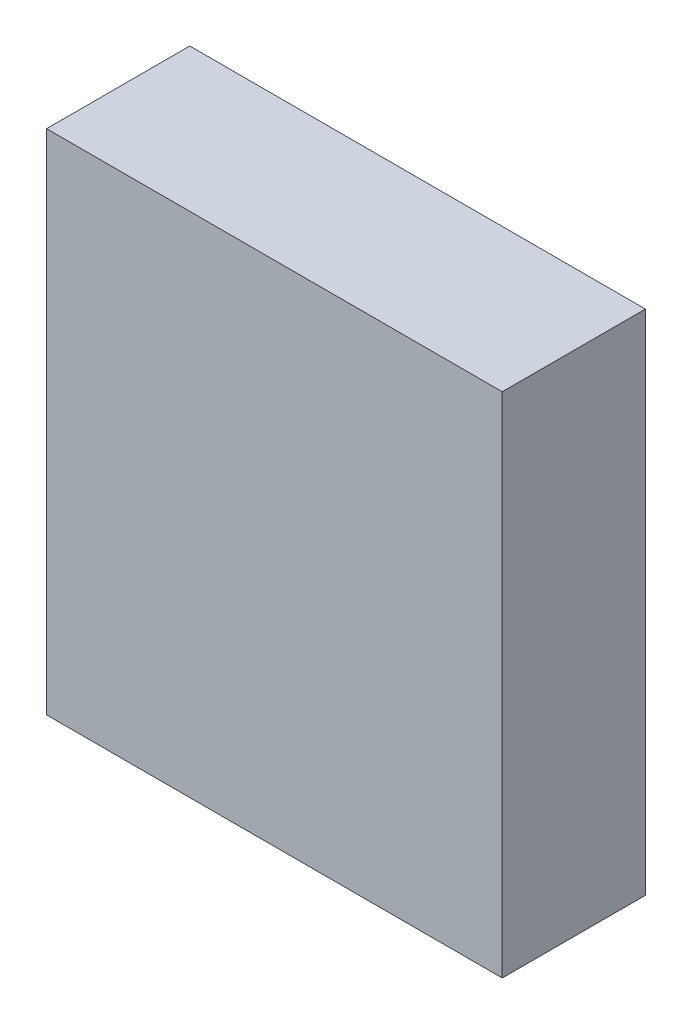
ISO-10303-21;
HEADER;
FILE_DESCRIPTION(('STEP AP214'),'2;1');
FILE_NAME('part.step','',(''),(''),'','','');
FILE_SCHEMA(('AUTOMOTIVE_DESIGN { 1 0 10303 214 1 1 1 1 }'));
ENDSEC;
DATA;
#1=APPLICATION_CONTEXT('core data for automotive mechanical design processes');
#2=APPLICATION_PROTOCOL_DEFINITION('international standard','automotive_design',2000,#1);
#3=PRODUCT_CONTEXT('',#1,'mechanical');
#4=PRODUCT('Part','Part','',(#3));
#5=PRODUCT_RELATED_PRODUCT_CATEGORY('part','',(#4));
#6=PRODUCT_DEFINITION_FORMATION('','',#4);
#7=PRODUCT_DEFINITION_CONTEXT('part definition',#1,'design');
#8=PRODUCT_DEFINITION('design','',#6,#7);
#9=PRODUCT_DEFINITION_SHAPE('','',#8);
#10=(LENGTH_UNIT() NAMED_UNIT(*) SI_UNIT(.MILLI.,.METRE.));
#11=(NAMED_UNIT(*) PLANE_ANGLE_UNIT() SI_UNIT($,.RADIAN.));
#12=(NAMED_UNIT(*) SI_UNIT($,.STERADIAN.) SOLID_ANGLE_UNIT());
#13=UNCERTAINTY_MEASURE_WITH_UNIT(LENGTH_MEASURE(1.E-05),#10,'distance_accuracy_value','');
#14=(GEOMETRIC_REPRESENTATION_CONTEXT(3) GLOBAL_UNCERTAINTY_ASSIGNED_CONTEXT((#13)) GLOBAL_UNIT_ASSIGNED_CONTEXT((#10,
#11,#12)) REPRESENTATION_CONTEXT('',''));
#15=CARTESIAN_POINT('',(0.,0.,0.));
#16=DIRECTION('',(0.,0.,1.));
#17=DIRECTION('',(1.,0.,0.));
#18=AXIS2_PLACEMENT_3D('',#15,#16,#17);
#19=CARTESIAN_POINT('',(-0.875,0.975,0.55));
#20=DIRECTION('',(1.,0.,0.));
#21=DIRECTION('',(0.,0.,-1.));
#22=AXIS2_PLACEMENT_3D('',#19,#20,#21);
#23=PLANE('',#22);
#24=DIRECTION('',(0.,-1.,0.));
#25=VECTOR('',#24,1.);
#26=CARTESIAN_POINT('',(-0.875,0.975,0.));
#27=LINE('',#26,#25);
#28=CARTESIAN_POINT('',(-0.875,0.975,0.));
#29=VERTEX_POINT('',#28);
#30=CARTESIAN_POINT('',(-0.875,-0.975,0.));
#31=VERTEX_POINT('',#30);
#32=EDGE_CURVE('E97',#29,#31,#27,.T.);
#33=ORIENTED_EDGE('',*,*,#32,.T.);
#34=DIRECTION('',(0.,0.,-1.));
#35=VECTOR('',#34,1.);
#36=CARTESIAN_POINT('',(-0.875,-0.975,0.55));
#37=LINE('',#36,#35);
#38=CARTESIAN_POINT('',(-0.875,-0.975,0.55));
#39=VERTEX_POINT('',#38);
#40=EDGE_CURVE('E11',#39,#31,#37,.T.);
#41=ORIENTED_EDGE('',*,*,#40,.F.);
#42=DIRECTION('',(0.,-1.,0.));
#43=VECTOR('',#42,1.);
#44=CARTESIAN_POINT('',(-0.875,0.975,0.55));
#45=LINE('',#44,#43);
#46=CARTESIAN_POINT('',(-0.875,0.975,0.55));
#47=VERTEX_POINT('',#46);
#48=EDGE_CURVE('E85',#47,#39,#45,.T.);
#49=ORIENTED_EDGE('',*,*,#48,.F.);
#50=DIRECTION('',(0.,0.,-1.));
#51=VECTOR('',#50,1.);
#52=CARTESIAN_POINT('',(-0.875,0.975,0.55));
#53=LINE('',#52,#51);
#54=EDGE_CURVE('E93',#47,#29,#53,.T.);
#55=ORIENTED_EDGE('',*,*,#54,.T.);
#56=EDGE_LOOP('',(#33,#41,#49,#55));
#57=FACE_BOUND('',#56,.T.);
#58=ADVANCED_FACE('F34',(#57),#23,.F.);
#59=CARTESIAN_POINT('',(-0.875,-0.975,0.55));
#60=DIRECTION('',(0.,1.,0.));
#61=DIRECTION('',(0.,0.,1.));
#62=AXIS2_PLACEMENT_3D('',#59,#60,#61);
#63=PLANE('',#62);
#64=DIRECTION('',(1.,0.,0.));
#65=VECTOR('',#64,1.);
#66=CARTESIAN_POINT('',(-0.875,-0.975,0.));
#67=LINE('',#66,#65);
#68=CARTESIAN_POINT('',(0.875,-0.975,0.));
#69=VERTEX_POINT('',#68);
#70=EDGE_CURVE('E89',#31,#69,#67,.T.);
#71=ORIENTED_EDGE('',*,*,#70,.T.);
#72=DIRECTION('',(0.,0.,-1.));
#73=VECTOR('',#72,1.);
#74=CARTESIAN_POINT('',(0.875,-0.975,0.55));
#75=LINE('',#74,#73);
#76=CARTESIAN_POINT('',(0.875,-0.975,0.55));
#77=VERTEX_POINT('',#76);
#78=EDGE_CURVE('E42',#77,#69,#75,.T.);
#79=ORIENTED_EDGE('',*,*,#78,.F.);
#80=DIRECTION('',(1.,0.,0.));
#81=VECTOR('',#80,1.);
#82=CARTESIAN_POINT('',(-0.875,-0.975,0.55));
#83=LINE('',#82,#81);
#84=EDGE_CURVE('E80',#39,#77,#83,.T.);
#85=ORIENTED_EDGE('',*,*,#84,.F.);
#86=ORIENTED_EDGE('',*,*,#40,.T.);
#87=EDGE_LOOP('',(#71,#79,#85,#86));
#88=FACE_BOUND('',#87,.T.);
#89=ADVANCED_FACE('F88',(#88),#63,.F.);
#90=CARTESIAN_POINT('',(0.875,-0.975,0.55));
#91=DIRECTION('',(-1.,0.,0.));
#92=DIRECTION('',(0.,0.,1.));
#93=AXIS2_PLACEMENT_3D('',#90,#91,#92);
#94=PLANE('',#93);
#95=DIRECTION('',(0.,1.,0.));
#96=VECTOR('',#95,1.);
#97=CARTESIAN_POINT('',(0.875,-0.975,0.));
#98=LINE('',#97,#96);
#99=CARTESIAN_POINT('',(0.875,0.975,0.));
#100=VERTEX_POINT('',#99);
#101=EDGE_CURVE('E67',#69,#100,#98,.T.);
#102=ORIENTED_EDGE('',*,*,#101,.T.);
#103=DIRECTION('',(0.,0.,-1.));
#104=VECTOR('',#103,1.);
#105=CARTESIAN_POINT('',(0.875,0.975,0.55));
#106=LINE('',#105,#104);
#107=CARTESIAN_POINT('',(0.875,0.975,0.55));
#108=VERTEX_POINT('',#107);
#109=EDGE_CURVE('E90',#108,#100,#106,.T.);
#110=ORIENTED_EDGE('',*,*,#109,.F.);
#111=DIRECTION('',(0.,1.,0.));
#112=VECTOR('',#111,1.);
#113=CARTESIAN_POINT('',(0.875,-0.975,0.55));
#114=LINE('',#113,#112);
#115=EDGE_CURVE('E83',#77,#108,#114,.T.);
#116=ORIENTED_EDGE('',*,*,#115,.F.);
#117=ORIENTED_EDGE('',*,*,#78,.T.);
#118=EDGE_LOOP('',(#102,#110,#116,#117));
#119=FACE_BOUND('',#118,.T.);
#120=ADVANCED_FACE('F91',(#119),#94,.F.);
#121=CARTESIAN_POINT('',(0.875,0.975,0.55));
#122=DIRECTION('',(0.,-1.,0.));
#123=DIRECTION('',(0.,0.,-1.));
#124=AXIS2_PLACEMENT_3D('',#121,#122,#123);
#125=PLANE('',#124);
#126=DIRECTION('',(-1.,0.,0.));
#127=VECTOR('',#126,1.);
#128=CARTESIAN_POINT('',(0.875,0.975,0.));
#129=LINE('',#128,#127);
#130=EDGE_CURVE('E73',#100,#29,#129,.T.);
#131=ORIENTED_EDGE('',*,*,#130,.T.);
#132=ORIENTED_EDGE('',*,*,#54,.F.);
#133=DIRECTION('',(-1.,0.,0.));
#134=VECTOR('',#133,1.);
#135=CARTESIAN_POINT('',(0.875,0.975,0.55));
#136=LINE('',#135,#134);
#137=EDGE_CURVE('E50',#108,#47,#136,.T.);
#138=ORIENTED_EDGE('',*,*,#137,.F.);
#139=ORIENTED_EDGE('',*,*,#109,.T.);
#140=EDGE_LOOP('',(#131,#132,#138,#139));
#141=FACE_BOUND('',#140,.T.);
#142=ADVANCED_FACE('F104',(#141),#125,.F.);
#143=CARTESIAN_POINT('',(0.,0.,0.55));
#144=DIRECTION('',(0.,0.,1.));
#145=DIRECTION('',(1.,0.,0.));
#146=AXIS2_PLACEMENT_3D('',#143,#144,#145);
#147=PLANE('',#146);
#148=ORIENTED_EDGE('',*,*,#48,.T.);
#149=ORIENTED_EDGE('',*,*,#84,.T.);
#150=ORIENTED_EDGE('',*,*,#115,.T.);
#151=ORIENTED_EDGE('',*,*,#137,.T.);
#152=EDGE_LOOP('',(#148,#149,#150,#151));
#153=FACE_BOUND('',#152,.T.);
#154=ADVANCED_FACE('F81',(#153),#147,.T.);
#155=CARTESIAN_POINT('',(0.,0.,0.));
#156=DIRECTION('',(0.,0.,1.));
#157=DIRECTION('',(1.,0.,0.));
#158=AXIS2_PLACEMENT_3D('',#155,#156,#157);
#159=PLANE('',#158);
#160=ORIENTED_EDGE('',*,*,#32,.F.);
#161=ORIENTED_EDGE('',*,*,#130,.F.);
#162=ORIENTED_EDGE('',*,*,#101,.F.);
#163=ORIENTED_EDGE('',*,*,#70,.F.);
#164=EDGE_LOOP('',(#160,#161,#162,#163));
#165=FACE_BOUND('',#164,.T.);
#166=ADVANCED_FACE('F107',(#165),#159,.F.);
#167=CLOSED_SHELL('',(#58,#89,#120,#142,#154,#166));
#168=MANIFOLD_SOLID_BREP('B2',#167);
#169=ADVANCED_BREP_SHAPE_REPRESENTATION('',(#18,#168),#14);
#170=SHAPE_DEFINITION_REPRESENTATION(#9,#169);
ENDSEC;
END-ISO-10303-21;
